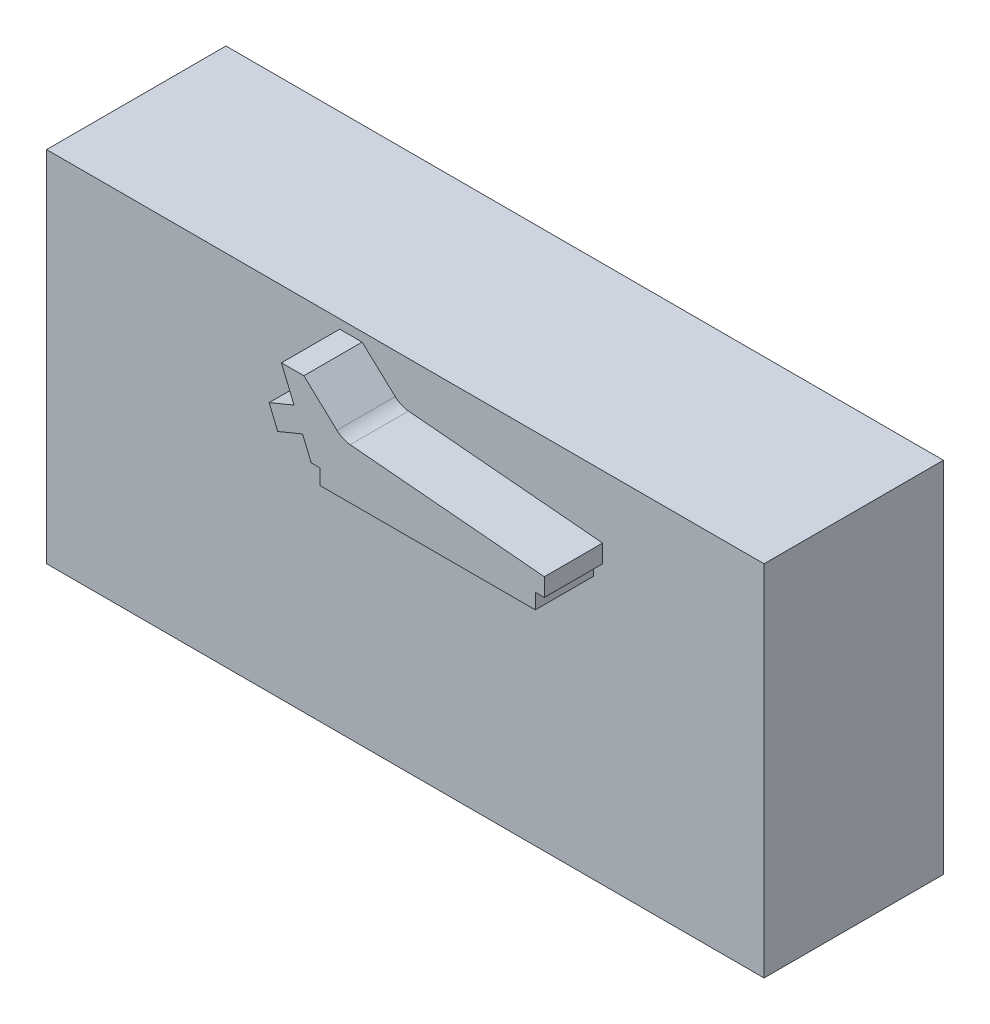
ISO-10303-21;
HEADER;
FILE_DESCRIPTION(('STEP AP214'),'2;1');
FILE_NAME('part.step','',(''),(''),'','','');
FILE_SCHEMA(('AUTOMOTIVE_DESIGN { 1 0 10303 214 1 1 1 1 }'));
ENDSEC;
DATA;
#1=APPLICATION_CONTEXT('core data for automotive mechanical design processes');
#2=APPLICATION_PROTOCOL_DEFINITION('international standard','automotive_design',2000,#1);
#3=PRODUCT_CONTEXT('',#1,'mechanical');
#4=PRODUCT('Part','Part','',(#3));
#5=PRODUCT_RELATED_PRODUCT_CATEGORY('part','',(#4));
#6=PRODUCT_DEFINITION_FORMATION('','',#4);
#7=PRODUCT_DEFINITION_CONTEXT('part definition',#1,'design');
#8=PRODUCT_DEFINITION('design','',#6,#7);
#9=PRODUCT_DEFINITION_SHAPE('','',#8);
#10=(LENGTH_UNIT() NAMED_UNIT(*) SI_UNIT(.MILLI.,.METRE.));
#11=(NAMED_UNIT(*) PLANE_ANGLE_UNIT() SI_UNIT($,.RADIAN.));
#12=(NAMED_UNIT(*) SI_UNIT($,.STERADIAN.) SOLID_ANGLE_UNIT());
#13=UNCERTAINTY_MEASURE_WITH_UNIT(LENGTH_MEASURE(1.E-05),#10,'distance_accuracy_value','');
#14=(GEOMETRIC_REPRESENTATION_CONTEXT(3) GLOBAL_UNCERTAINTY_ASSIGNED_CONTEXT((#13)) GLOBAL_UNIT_ASSIGNED_CONTEXT((#10,
#11,#12)) REPRESENTATION_CONTEXT('',''));
#15=CARTESIAN_POINT('',(0.,0.,0.));
#16=DIRECTION('',(0.,0.,1.));
#17=DIRECTION('',(1.,0.,0.));
#18=AXIS2_PLACEMENT_3D('',#15,#16,#17);
#19=CARTESIAN_POINT('',(0.,0.,50.8));
#20=DIRECTION('',(1.,0.,0.));
#21=DIRECTION('',(0.,0.,-1.));
#22=AXIS2_PLACEMENT_3D('',#19,#20,#21);
#23=PLANE('',#22);
#24=DIRECTION('',(0.,-1.,0.));
#25=VECTOR('',#24,1.);
#26=CARTESIAN_POINT('',(0.,0.,0.));
#27=LINE('',#26,#25);
#28=CARTESIAN_POINT('',(0.,101.6,0.));
#29=VERTEX_POINT('',#28);
#30=CARTESIAN_POINT('',(0.,0.,0.));
#31=VERTEX_POINT('',#30);
#32=EDGE_CURVE('E173',#29,#31,#27,.T.);
#33=ORIENTED_EDGE('',*,*,#32,.T.);
#34=DIRECTION('',(0.,0.,-1.));
#35=VECTOR('',#34,1.);
#36=CARTESIAN_POINT('',(0.,0.,50.8));
#37=LINE('',#36,#35);
#38=CARTESIAN_POINT('',(0.,0.,50.8));
#39=VERTEX_POINT('',#38);
#40=EDGE_CURVE('E11',#39,#31,#37,.T.);
#41=ORIENTED_EDGE('',*,*,#40,.F.);
#42=DIRECTION('',(0.,-1.,0.));
#43=VECTOR('',#42,1.);
#44=CARTESIAN_POINT('',(0.,0.,50.8));
#45=LINE('',#44,#43);
#46=CARTESIAN_POINT('',(0.,101.6,50.8));
#47=VERTEX_POINT('',#46);
#48=EDGE_CURVE('E300',#47,#39,#45,.T.);
#49=ORIENTED_EDGE('',*,*,#48,.F.);
#50=DIRECTION('',(0.,0.,-1.));
#51=VECTOR('',#50,1.);
#52=CARTESIAN_POINT('',(0.,101.6,50.8));
#53=LINE('',#52,#51);
#54=EDGE_CURVE('E309',#47,#29,#53,.T.);
#55=ORIENTED_EDGE('',*,*,#54,.T.);
#56=EDGE_LOOP('',(#33,#41,#49,#55));
#57=FACE_BOUND('',#56,.T.);
#58=ADVANCED_FACE('F37',(#57),#23,.F.);
#59=CARTESIAN_POINT('',(0.,0.,50.8));
#60=DIRECTION('',(0.,1.,0.));
#61=DIRECTION('',(0.,0.,1.));
#62=AXIS2_PLACEMENT_3D('',#59,#60,#61);
#63=PLANE('',#62);
#64=DIRECTION('',(1.,0.,0.));
#65=VECTOR('',#64,1.);
#66=CARTESIAN_POINT('',(0.,0.,0.));
#67=LINE('',#66,#65);
#68=CARTESIAN_POINT('',(203.2,0.,0.));
#69=VERTEX_POINT('',#68);
#70=EDGE_CURVE('E294',#31,#69,#67,.T.);
#71=ORIENTED_EDGE('',*,*,#70,.T.);
#72=DIRECTION('',(0.,0.,-1.));
#73=VECTOR('',#72,1.);
#74=CARTESIAN_POINT('',(203.2,0.,50.8));
#75=LINE('',#74,#73);
#76=CARTESIAN_POINT('',(203.2,0.,50.8));
#77=VERTEX_POINT('',#76);
#78=EDGE_CURVE('E44',#77,#69,#75,.T.);
#79=ORIENTED_EDGE('',*,*,#78,.F.);
#80=DIRECTION('',(1.,0.,0.));
#81=VECTOR('',#80,1.);
#82=CARTESIAN_POINT('',(0.,0.,50.8));
#83=LINE('',#82,#81);
#84=EDGE_CURVE('E303',#39,#77,#83,.T.);
#85=ORIENTED_EDGE('',*,*,#84,.F.);
#86=ORIENTED_EDGE('',*,*,#40,.T.);
#87=EDGE_LOOP('',(#71,#79,#85,#86));
#88=FACE_BOUND('',#87,.T.);
#89=ADVANCED_FACE('F335',(#88),#63,.F.);
#90=CARTESIAN_POINT('',(203.2,0.,50.8));
#91=DIRECTION('',(-1.,0.,0.));
#92=DIRECTION('',(0.,0.,1.));
#93=AXIS2_PLACEMENT_3D('',#90,#91,#92);
#94=PLANE('',#93);
#95=DIRECTION('',(0.,1.,0.));
#96=VECTOR('',#95,1.);
#97=CARTESIAN_POINT('',(203.2,0.,0.));
#98=LINE('',#97,#96);
#99=CARTESIAN_POINT('',(203.2,101.6,0.));
#100=VERTEX_POINT('',#99);
#101=EDGE_CURVE('E296',#69,#100,#98,.T.);
#102=ORIENTED_EDGE('',*,*,#101,.T.);
#103=DIRECTION('',(0.,0.,-1.));
#104=VECTOR('',#103,1.);
#105=CARTESIAN_POINT('',(203.2,101.6,50.8));
#106=LINE('',#105,#104);
#107=CARTESIAN_POINT('',(203.2,101.6,50.8));
#108=VERTEX_POINT('',#107);
#109=EDGE_CURVE('E312',#108,#100,#106,.T.);
#110=ORIENTED_EDGE('',*,*,#109,.F.);
#111=DIRECTION('',(0.,1.,0.));
#112=VECTOR('',#111,1.);
#113=CARTESIAN_POINT('',(203.2,0.,50.8));
#114=LINE('',#113,#112);
#115=EDGE_CURVE('E305',#77,#108,#114,.T.);
#116=ORIENTED_EDGE('',*,*,#115,.F.);
#117=ORIENTED_EDGE('',*,*,#78,.T.);
#118=EDGE_LOOP('',(#102,#110,#116,#117));
#119=FACE_BOUND('',#118,.T.);
#120=ADVANCED_FACE('F319',(#119),#94,.F.);
#121=CARTESIAN_POINT('',(0.,101.6,50.8));
#122=DIRECTION('',(0.,-1.,0.));
#123=DIRECTION('',(0.,0.,-1.));
#124=AXIS2_PLACEMENT_3D('',#121,#122,#123);
#125=PLANE('',#124);
#126=DIRECTION('',(-1.,0.,0.));
#127=VECTOR('',#126,1.);
#128=CARTESIAN_POINT('',(0.,101.6,0.));
#129=LINE('',#128,#127);
#130=EDGE_CURVE('E298',#100,#29,#129,.T.);
#131=ORIENTED_EDGE('',*,*,#130,.T.);
#132=ORIENTED_EDGE('',*,*,#54,.F.);
#133=DIRECTION('',(-1.,0.,0.));
#134=VECTOR('',#133,1.);
#135=CARTESIAN_POINT('',(0.,101.6,50.8));
#136=LINE('',#135,#134);
#137=EDGE_CURVE('E307',#108,#47,#136,.T.);
#138=ORIENTED_EDGE('',*,*,#137,.F.);
#139=ORIENTED_EDGE('',*,*,#109,.T.);
#140=EDGE_LOOP('',(#131,#132,#138,#139));
#141=FACE_BOUND('',#140,.T.);
#142=ADVANCED_FACE('F328',(#141),#125,.F.);
#143=CARTESIAN_POINT('',(0.,101.6,50.8));
#144=DIRECTION('',(0.,0.,-1.));
#145=DIRECTION('',(-1.,0.,0.));
#146=AXIS2_PLACEMENT_3D('',#143,#144,#145);
#147=PLANE('',#146);
#148=DIRECTION('',(-0.733266821544927,0.679941003632962,0.));
#149=VECTOR('',#148,1.);
#150=CARTESIAN_POINT('',(208.181982596549,-11.1085959651032,50.8));
#151=LINE('',#150,#149);
#152=CARTESIAN_POINT('',(98.7376529803762,90.3765457795755,50.8));
#153=VERTEX_POINT('',#152);
#154=CARTESIAN_POINT('',(89.3731804125787,99.06,50.8));
#155=VERTEX_POINT('',#154);
#156=EDGE_CURVE('E51',#153,#155,#151,.T.);
#157=ORIENTED_EDGE('',*,*,#156,.F.);
#158=CARTESIAN_POINT('',(103.055278353446,95.0327900963858,50.8));
#159=DIRECTION('',(0.,0.,1.));
#160=DIRECTION('',(1.,0.,0.));
#161=AXIS2_PLACEMENT_3D('',#158,#159,#160);
#162=CIRCLE('',#161,6.35);
#163=CARTESIAN_POINT('',(102.493050685143,88.7077288279872,50.8));
#164=VERTEX_POINT('',#163);
#165=EDGE_CURVE('E171',#153,#164,#162,.T.);
#166=ORIENTED_EDGE('',*,*,#165,.T.);
#167=DIRECTION('',(-0.996072640692687,0.0885397902837935,0.));
#168=VECTOR('',#167,1.);
#169=CARTESIAN_POINT('',(120.546883616443,87.1029436785384,50.8));
#170=LINE('',#169,#168);
#171=CARTESIAN_POINT('',(157.48,83.82,50.8));
#172=VERTEX_POINT('',#171);
#173=EDGE_CURVE('E188',#172,#164,#170,.T.);
#174=ORIENTED_EDGE('',*,*,#173,.F.);
#175=DIRECTION('',(0.,1.,0.));
#176=VECTOR('',#175,1.);
#177=CARTESIAN_POINT('',(157.48,-126.049497006446,50.8));
#178=LINE('',#177,#176);
#179=CARTESIAN_POINT('',(157.48,78.74,50.8));
#180=VERTEX_POINT('',#179);
#181=EDGE_CURVE('E191',#180,#172,#178,.T.);
#182=ORIENTED_EDGE('',*,*,#181,.F.);
#183=DIRECTION('',(1.,0.,0.));
#184=VECTOR('',#183,1.);
#185=CARTESIAN_POINT('',(101.6,78.74,50.8));
#186=LINE('',#185,#184);
#187=CARTESIAN_POINT('',(154.94,78.74,50.8));
#188=VERTEX_POINT('',#187);
#189=EDGE_CURVE('E249',#188,#180,#186,.T.);
#190=ORIENTED_EDGE('',*,*,#189,.F.);
#191=DIRECTION('',(0.,1.,0.));
#192=VECTOR('',#191,1.);
#193=CARTESIAN_POINT('',(154.94,-126.049497006446,50.8));
#194=LINE('',#193,#192);
#195=CARTESIAN_POINT('',(154.94,74.422,50.8));
#196=VERTEX_POINT('',#195);
#197=EDGE_CURVE('E246',#196,#188,#194,.T.);
#198=ORIENTED_EDGE('',*,*,#197,.F.);
#199=DIRECTION('',(1.,0.,0.));
#200=VECTOR('',#199,1.);
#201=CARTESIAN_POINT('',(101.6,74.422,50.8));
#202=LINE('',#201,#200);
#203=CARTESIAN_POINT('',(93.98,74.422,50.8));
#204=VERTEX_POINT('',#203);
#205=EDGE_CURVE('E243',#204,#196,#202,.T.);
#206=ORIENTED_EDGE('',*,*,#205,.F.);
#207=DIRECTION('',(0.,-1.,0.));
#208=VECTOR('',#207,1.);
#209=CARTESIAN_POINT('',(93.98,-126.049497006446,50.8));
#210=LINE('',#209,#208);
#211=CARTESIAN_POINT('',(93.98,78.74,50.8));
#212=VERTEX_POINT('',#211);
#213=EDGE_CURVE('E240',#212,#204,#210,.T.);
#214=ORIENTED_EDGE('',*,*,#213,.F.);
#215=DIRECTION('',(1.,0.,0.));
#216=VECTOR('',#215,1.);
#217=CARTESIAN_POINT('',(101.6,78.74,50.8));
#218=LINE('',#217,#216);
#219=CARTESIAN_POINT('',(91.44,78.74,50.8));
#220=VERTEX_POINT('',#219);
#221=EDGE_CURVE('E237',#220,#212,#218,.T.);
#222=ORIENTED_EDGE('',*,*,#221,.F.);
#223=DIRECTION('',(0.382683432365087,-0.923879532511288,0.));
#224=VECTOR('',#223,1.);
#225=CARTESIAN_POINT('',(165.331918576092,-99.6508719761715,50.8));
#226=LINE('',#225,#224);
#227=CARTESIAN_POINT('',(89.0099602044817,84.6066350314467,50.8));
#228=VERTEX_POINT('',#227);
#229=EDGE_CURVE('E234',#228,#220,#226,.T.);
#230=ORIENTED_EDGE('',*,*,#229,.F.);
#231=DIRECTION('',(0.923879532511288,0.382683432365087,0.));
#232=VECTOR('',#231,1.);
#233=CARTESIAN_POINT('',(25.2780416283897,58.2080100011718,50.8));
#234=LINE('',#233,#232);
#235=CARTESIAN_POINT('',(81.9699981667457,81.6905872768247,50.8));
#236=VERTEX_POINT('',#235);
#237=EDGE_CURVE('E231',#236,#228,#234,.T.);
#238=ORIENTED_EDGE('',*,*,#237,.F.);
#239=DIRECTION('',(0.382683432365087,-0.923879532511288,0.));
#240=VECTOR('',#239,1.);
#241=CARTESIAN_POINT('',(158.291956538356,-102.566919730793,50.8));
#242=LINE('',#241,#240);
#243=CARTESIAN_POINT('',(79.5399583712273,87.5572223082714,50.8));
#244=VERTEX_POINT('',#243);
#245=EDGE_CURVE('E228',#244,#236,#242,.T.);
#246=ORIENTED_EDGE('',*,*,#245,.F.);
#247=DIRECTION('',(0.923879532511287,0.382683432365089,0.));
#248=VECTOR('',#247,1.);
#249=CARTESIAN_POINT('',(22.848001832871,64.0746450326182,50.8));
#250=LINE('',#249,#248);
#251=CARTESIAN_POINT('',(86.5799204089634,90.4732700628933,50.8));
#252=VERTEX_POINT('',#251);
#253=EDGE_CURVE('E226',#244,#252,#250,.T.);
#254=ORIENTED_EDGE('',*,*,#253,.T.);
#255=DIRECTION('',(-0.382683432365091,0.923879532511286,0.));
#256=VECTOR('',#255,1.);
#257=CARTESIAN_POINT('',(165.331918576093,-99.6508719761708,50.8));
#258=LINE('',#257,#256);
#259=CARTESIAN_POINT('',(83.0231804125788,99.06,50.8));
#260=VERTEX_POINT('',#259);
#261=EDGE_CURVE('E224',#252,#260,#258,.T.);
#262=ORIENTED_EDGE('',*,*,#261,.T.);
#263=DIRECTION('',(-1.,0.,0.));
#264=VECTOR('',#263,1.);
#265=CARTESIAN_POINT('',(101.6,99.06,50.8));
#266=LINE('',#265,#264);
#267=EDGE_CURVE('E56',#155,#260,#266,.T.);
#268=ORIENTED_EDGE('',*,*,#267,.F.);
#269=EDGE_LOOP('',(#157,#166,#174,#182,#190,#198,#206,#214,#222,#230,#238,#246,#254,#262,#268));
#270=FACE_BOUND('',#269,.T.);
#271=ORIENTED_EDGE('',*,*,#48,.T.);
#272=ORIENTED_EDGE('',*,*,#84,.T.);
#273=ORIENTED_EDGE('',*,*,#115,.T.);
#274=ORIENTED_EDGE('',*,*,#137,.T.);
#275=EDGE_LOOP('',(#271,#272,#273,#274));
#276=FACE_BOUND('',#275,.T.);
#277=ADVANCED_FACE('F334',(#270,#276),#147,.F.);
#278=CARTESIAN_POINT('',(0.,101.6,0.));
#279=DIRECTION('',(0.,0.,-1.));
#280=DIRECTION('',(-1.,0.,0.));
#281=AXIS2_PLACEMENT_3D('',#278,#279,#280);
#282=PLANE('',#281);
#283=ORIENTED_EDGE('',*,*,#32,.F.);
#284=ORIENTED_EDGE('',*,*,#130,.F.);
#285=ORIENTED_EDGE('',*,*,#101,.F.);
#286=ORIENTED_EDGE('',*,*,#70,.F.);
#287=EDGE_LOOP('',(#283,#284,#285,#286));
#288=FACE_BOUND('',#287,.T.);
#289=ADVANCED_FACE('F325',(#288),#282,.T.);
#290=CARTESIAN_POINT('',(103.055278353446,95.0327900963858,67.31));
#291=DIRECTION('',(0.,0.,-1.));
#292=DIRECTION('',(-1.,0.,0.));
#293=AXIS2_PLACEMENT_3D('',#290,#291,#292);
#294=CYLINDRICAL_SURFACE('',#293,6.35);
#295=ORIENTED_EDGE('',*,*,#165,.F.);
#296=DIRECTION('',(0.,0.,-1.));
#297=VECTOR('',#296,1.);
#298=CARTESIAN_POINT('',(98.7376529803762,90.3765457795755,67.31));
#299=LINE('',#298,#297);
#300=CARTESIAN_POINT('',(98.7376529803762,90.3765457795755,67.31));
#301=VERTEX_POINT('',#300);
#302=EDGE_CURVE('E165',#301,#153,#299,.T.);
#303=ORIENTED_EDGE('',*,*,#302,.F.);
#304=CARTESIAN_POINT('',(103.055278353446,95.0327900963858,67.31));
#305=DIRECTION('',(0.,0.,1.));
#306=DIRECTION('',(1.,0.,0.));
#307=AXIS2_PLACEMENT_3D('',#304,#305,#306);
#308=CIRCLE('',#307,6.35);
#309=CARTESIAN_POINT('',(102.493050685143,88.7077288279872,67.31));
#310=VERTEX_POINT('',#309);
#311=EDGE_CURVE('E170',#301,#310,#308,.T.);
#312=ORIENTED_EDGE('',*,*,#311,.T.);
#313=DIRECTION('',(0.,0.,-1.));
#314=VECTOR('',#313,1.);
#315=CARTESIAN_POINT('',(102.493050685143,88.7077288279872,67.31));
#316=LINE('',#315,#314);
#317=EDGE_CURVE('E220',#310,#164,#316,.T.);
#318=ORIENTED_EDGE('',*,*,#317,.T.);
#319=EDGE_LOOP('',(#295,#303,#312,#318));
#320=FACE_BOUND('',#319,.T.);
#321=ADVANCED_FACE('F167',(#320),#294,.F.);
#322=CARTESIAN_POINT('',(208.181982596549,-11.1085959651032,67.31));
#323=DIRECTION('',(-0.679941003632963,-0.733266821544927,0.));
#324=DIRECTION('',(0.733266821544927,-0.679941003632963,0.));
#325=AXIS2_PLACEMENT_3D('',#322,#323,#324);
#326=PLANE('',#325);
#327=ORIENTED_EDGE('',*,*,#156,.T.);
#328=DIRECTION('',(0.,0.,-1.));
#329=VECTOR('',#328,1.);
#330=CARTESIAN_POINT('',(89.3731804125787,99.06,67.31));
#331=LINE('',#330,#329);
#332=CARTESIAN_POINT('',(89.3731804125787,99.06,67.31));
#333=VERTEX_POINT('',#332);
#334=EDGE_CURVE('E174',#333,#155,#331,.T.);
#335=ORIENTED_EDGE('',*,*,#334,.F.);
#336=DIRECTION('',(-0.733266821544927,0.679941003632962,0.));
#337=VECTOR('',#336,1.);
#338=CARTESIAN_POINT('',(208.181982596549,-11.1085959651032,67.31));
#339=LINE('',#338,#337);
#340=EDGE_CURVE('E177',#301,#333,#339,.T.);
#341=ORIENTED_EDGE('',*,*,#340,.F.);
#342=ORIENTED_EDGE('',*,*,#302,.T.);
#343=EDGE_LOOP('',(#327,#335,#341,#342));
#344=FACE_BOUND('',#343,.T.);
#345=ADVANCED_FACE('F178',(#344),#326,.F.);
#346=CARTESIAN_POINT('',(101.6,99.06,67.31));
#347=DIRECTION('',(0.,-1.,0.));
#348=DIRECTION('',(0.,0.,-1.));
#349=AXIS2_PLACEMENT_3D('',#346,#347,#348);
#350=PLANE('',#349);
#351=ORIENTED_EDGE('',*,*,#267,.T.);
#352=DIRECTION('',(0.,0.,-1.));
#353=VECTOR('',#352,1.);
#354=CARTESIAN_POINT('',(83.0231804125788,99.06,67.31));
#355=LINE('',#354,#353);
#356=CARTESIAN_POINT('',(83.0231804125788,99.06,67.31));
#357=VERTEX_POINT('',#356);
#358=EDGE_CURVE('E288',#357,#260,#355,.T.);
#359=ORIENTED_EDGE('',*,*,#358,.F.);
#360=DIRECTION('',(-1.,0.,0.));
#361=VECTOR('',#360,1.);
#362=CARTESIAN_POINT('',(101.6,99.06,67.31));
#363=LINE('',#362,#361);
#364=EDGE_CURVE('E182',#333,#357,#363,.T.);
#365=ORIENTED_EDGE('',*,*,#364,.F.);
#366=ORIENTED_EDGE('',*,*,#334,.T.);
#367=EDGE_LOOP('',(#351,#359,#365,#366));
#368=FACE_BOUND('',#367,.T.);
#369=ADVANCED_FACE('F353',(#368),#350,.F.);
#370=CARTESIAN_POINT('',(165.331918576093,-99.6508719761708,67.31));
#371=DIRECTION('',(-0.923879532511286,-0.382683432365091,0.));
#372=DIRECTION('',(0.382683432365091,-0.923879532511286,0.));
#373=AXIS2_PLACEMENT_3D('',#370,#371,#372);
#374=PLANE('',#373);
#375=ORIENTED_EDGE('',*,*,#261,.F.);
#376=DIRECTION('',(0.,0.,-1.));
#377=VECTOR('',#376,1.);
#378=CARTESIAN_POINT('',(86.5799204089634,90.4732700628933,67.31));
#379=LINE('',#378,#377);
#380=CARTESIAN_POINT('',(86.5799204089634,90.4732700628933,67.31));
#381=VERTEX_POINT('',#380);
#382=EDGE_CURVE('E285',#381,#252,#379,.T.);
#383=ORIENTED_EDGE('',*,*,#382,.F.);
#384=DIRECTION('',(-0.382683432365091,0.923879532511286,0.));
#385=VECTOR('',#384,1.);
#386=CARTESIAN_POINT('',(165.331918576093,-99.6508719761708,67.31));
#387=LINE('',#386,#385);
#388=EDGE_CURVE('E195',#381,#357,#387,.T.);
#389=ORIENTED_EDGE('',*,*,#388,.T.);
#390=ORIENTED_EDGE('',*,*,#358,.T.);
#391=EDGE_LOOP('',(#375,#383,#389,#390));
#392=FACE_BOUND('',#391,.T.);
#393=ADVANCED_FACE('F356',(#392),#374,.T.);
#394=CARTESIAN_POINT('',(22.848001832871,64.0746450326182,67.31));
#395=DIRECTION('',(-0.382683432365089,0.923879532511287,0.));
#396=DIRECTION('',(-0.923879532511287,-0.382683432365089,0.));
#397=AXIS2_PLACEMENT_3D('',#394,#395,#396);
#398=PLANE('',#397);
#399=ORIENTED_EDGE('',*,*,#253,.F.);
#400=DIRECTION('',(0.,0.,-1.));
#401=VECTOR('',#400,1.);
#402=CARTESIAN_POINT('',(79.5399583712274,87.5572223082714,67.31));
#403=LINE('',#402,#401);
#404=CARTESIAN_POINT('',(79.5399583712274,87.5572223082714,67.31));
#405=VERTEX_POINT('',#404);
#406=EDGE_CURVE('E282',#405,#244,#403,.T.);
#407=ORIENTED_EDGE('',*,*,#406,.F.);
#408=DIRECTION('',(0.923879532511287,0.382683432365089,0.));
#409=VECTOR('',#408,1.);
#410=CARTESIAN_POINT('',(22.848001832871,64.0746450326182,67.31));
#411=LINE('',#410,#409);
#412=EDGE_CURVE('E198',#405,#381,#411,.T.);
#413=ORIENTED_EDGE('',*,*,#412,.T.);
#414=ORIENTED_EDGE('',*,*,#382,.T.);
#415=EDGE_LOOP('',(#399,#407,#413,#414));
#416=FACE_BOUND('',#415,.T.);
#417=ADVANCED_FACE('F360',(#416),#398,.T.);
#418=CARTESIAN_POINT('',(158.291956538356,-102.566919730793,67.31));
#419=DIRECTION('',(0.923879532511288,0.382683432365087,0.));
#420=DIRECTION('',(-0.382683432365087,0.923879532511288,0.));
#421=AXIS2_PLACEMENT_3D('',#418,#419,#420);
#422=PLANE('',#421);
#423=ORIENTED_EDGE('',*,*,#245,.T.);
#424=DIRECTION('',(0.,0.,-1.));
#425=VECTOR('',#424,1.);
#426=CARTESIAN_POINT('',(81.9699981667457,81.6905872768247,67.31));
#427=LINE('',#426,#425);
#428=CARTESIAN_POINT('',(81.9699981667457,81.6905872768247,67.31));
#429=VERTEX_POINT('',#428);
#430=EDGE_CURVE('E279',#429,#236,#427,.T.);
#431=ORIENTED_EDGE('',*,*,#430,.F.);
#432=DIRECTION('',(0.382683432365087,-0.923879532511288,0.));
#433=VECTOR('',#432,1.);
#434=CARTESIAN_POINT('',(158.291956538356,-102.566919730793,67.31));
#435=LINE('',#434,#433);
#436=EDGE_CURVE('E201',#405,#429,#435,.T.);
#437=ORIENTED_EDGE('',*,*,#436,.F.);
#438=ORIENTED_EDGE('',*,*,#406,.T.);
#439=EDGE_LOOP('',(#423,#431,#437,#438));
#440=FACE_BOUND('',#439,.T.);
#441=ADVANCED_FACE('F364',(#440),#422,.F.);
#442=CARTESIAN_POINT('',(25.2780416283897,58.2080100011718,67.31));
#443=DIRECTION('',(-0.382683432365087,0.923879532511288,0.));
#444=DIRECTION('',(-0.923879532511288,-0.382683432365087,0.));
#445=AXIS2_PLACEMENT_3D('',#442,#443,#444);
#446=PLANE('',#445);
#447=ORIENTED_EDGE('',*,*,#237,.T.);
#448=DIRECTION('',(0.,0.,-1.));
#449=VECTOR('',#448,1.);
#450=CARTESIAN_POINT('',(89.0099602044817,84.6066350314467,67.31));
#451=LINE('',#450,#449);
#452=CARTESIAN_POINT('',(89.0099602044817,84.6066350314467,67.31));
#453=VERTEX_POINT('',#452);
#454=EDGE_CURVE('E276',#453,#228,#451,.T.);
#455=ORIENTED_EDGE('',*,*,#454,.F.);
#456=DIRECTION('',(0.923879532511288,0.382683432365087,0.));
#457=VECTOR('',#456,1.);
#458=CARTESIAN_POINT('',(25.2780416283897,58.2080100011718,67.31));
#459=LINE('',#458,#457);
#460=EDGE_CURVE('E203',#429,#453,#459,.T.);
#461=ORIENTED_EDGE('',*,*,#460,.F.);
#462=ORIENTED_EDGE('',*,*,#430,.T.);
#463=EDGE_LOOP('',(#447,#455,#461,#462));
#464=FACE_BOUND('',#463,.T.);
#465=ADVANCED_FACE('F368',(#464),#446,.F.);
#466=CARTESIAN_POINT('',(165.331918576092,-99.6508719761715,67.31));
#467=DIRECTION('',(0.923879532511288,0.382683432365087,0.));
#468=DIRECTION('',(-0.382683432365087,0.923879532511288,0.));
#469=AXIS2_PLACEMENT_3D('',#466,#467,#468);
#470=PLANE('',#469);
#471=ORIENTED_EDGE('',*,*,#229,.T.);
#472=DIRECTION('',(0.,0.,-1.));
#473=VECTOR('',#472,1.);
#474=CARTESIAN_POINT('',(91.44,78.74,67.31));
#475=LINE('',#474,#473);
#476=CARTESIAN_POINT('',(91.44,78.74,67.31));
#477=VERTEX_POINT('',#476);
#478=EDGE_CURVE('E273',#477,#220,#475,.T.);
#479=ORIENTED_EDGE('',*,*,#478,.F.);
#480=DIRECTION('',(0.382683432365087,-0.923879532511288,0.));
#481=VECTOR('',#480,1.);
#482=CARTESIAN_POINT('',(165.331918576092,-99.6508719761715,67.31));
#483=LINE('',#482,#481);
#484=EDGE_CURVE('E205',#453,#477,#483,.T.);
#485=ORIENTED_EDGE('',*,*,#484,.F.);
#486=ORIENTED_EDGE('',*,*,#454,.T.);
#487=EDGE_LOOP('',(#471,#479,#485,#486));
#488=FACE_BOUND('',#487,.T.);
#489=ADVANCED_FACE('F372',(#488),#470,.F.);
#490=CARTESIAN_POINT('',(101.6,78.74,67.31));
#491=DIRECTION('',(0.,1.,0.));
#492=DIRECTION('',(0.,0.,1.));
#493=AXIS2_PLACEMENT_3D('',#490,#491,#492);
#494=PLANE('',#493);
#495=ORIENTED_EDGE('',*,*,#221,.T.);
#496=DIRECTION('',(0.,0.,-1.));
#497=VECTOR('',#496,1.);
#498=CARTESIAN_POINT('',(93.98,78.74,67.31));
#499=LINE('',#498,#497);
#500=CARTESIAN_POINT('',(93.98,78.74,67.31));
#501=VERTEX_POINT('',#500);
#502=EDGE_CURVE('E270',#501,#212,#499,.T.);
#503=ORIENTED_EDGE('',*,*,#502,.F.);
#504=DIRECTION('',(1.,0.,0.));
#505=VECTOR('',#504,1.);
#506=CARTESIAN_POINT('',(101.6,78.74,67.31));
#507=LINE('',#506,#505);
#508=EDGE_CURVE('E207',#477,#501,#507,.T.);
#509=ORIENTED_EDGE('',*,*,#508,.F.);
#510=ORIENTED_EDGE('',*,*,#478,.T.);
#511=EDGE_LOOP('',(#495,#503,#509,#510));
#512=FACE_BOUND('',#511,.T.);
#513=ADVANCED_FACE('F376',(#512),#494,.F.);
#514=CARTESIAN_POINT('',(93.98,-126.049497006446,67.31));
#515=DIRECTION('',(1.,0.,0.));
#516=DIRECTION('',(0.,0.,-1.));
#517=AXIS2_PLACEMENT_3D('',#514,#515,#516);
#518=PLANE('',#517);
#519=ORIENTED_EDGE('',*,*,#213,.T.);
#520=DIRECTION('',(0.,0.,-1.));
#521=VECTOR('',#520,1.);
#522=CARTESIAN_POINT('',(93.98,74.422,67.31));
#523=LINE('',#522,#521);
#524=CARTESIAN_POINT('',(93.98,74.422,67.31));
#525=VERTEX_POINT('',#524);
#526=EDGE_CURVE('E267',#525,#204,#523,.T.);
#527=ORIENTED_EDGE('',*,*,#526,.F.);
#528=DIRECTION('',(0.,-1.,0.));
#529=VECTOR('',#528,1.);
#530=CARTESIAN_POINT('',(93.98,-126.049497006446,67.31));
#531=LINE('',#530,#529);
#532=EDGE_CURVE('E209',#501,#525,#531,.T.);
#533=ORIENTED_EDGE('',*,*,#532,.F.);
#534=ORIENTED_EDGE('',*,*,#502,.T.);
#535=EDGE_LOOP('',(#519,#527,#533,#534));
#536=FACE_BOUND('',#535,.T.);
#537=ADVANCED_FACE('F380',(#536),#518,.F.);
#538=CARTESIAN_POINT('',(101.6,74.422,67.31));
#539=DIRECTION('',(0.,1.,0.));
#540=DIRECTION('',(0.,0.,1.));
#541=AXIS2_PLACEMENT_3D('',#538,#539,#540);
#542=PLANE('',#541);
#543=ORIENTED_EDGE('',*,*,#205,.T.);
#544=DIRECTION('',(0.,0.,-1.));
#545=VECTOR('',#544,1.);
#546=CARTESIAN_POINT('',(154.94,74.422,67.31));
#547=LINE('',#546,#545);
#548=CARTESIAN_POINT('',(154.94,74.422,67.31));
#549=VERTEX_POINT('',#548);
#550=EDGE_CURVE('E264',#549,#196,#547,.T.);
#551=ORIENTED_EDGE('',*,*,#550,.F.);
#552=DIRECTION('',(1.,0.,0.));
#553=VECTOR('',#552,1.);
#554=CARTESIAN_POINT('',(101.6,74.422,67.31));
#555=LINE('',#554,#553);
#556=EDGE_CURVE('E211',#525,#549,#555,.T.);
#557=ORIENTED_EDGE('',*,*,#556,.F.);
#558=ORIENTED_EDGE('',*,*,#526,.T.);
#559=EDGE_LOOP('',(#543,#551,#557,#558));
#560=FACE_BOUND('',#559,.T.);
#561=ADVANCED_FACE('F384',(#560),#542,.F.);
#562=CARTESIAN_POINT('',(154.94,-126.049497006446,67.31));
#563=DIRECTION('',(-1.,0.,0.));
#564=DIRECTION('',(0.,0.,1.));
#565=AXIS2_PLACEMENT_3D('',#562,#563,#564);
#566=PLANE('',#565);
#567=ORIENTED_EDGE('',*,*,#197,.T.);
#568=DIRECTION('',(0.,0.,-1.));
#569=VECTOR('',#568,1.);
#570=CARTESIAN_POINT('',(154.94,78.74,67.31));
#571=LINE('',#570,#569);
#572=CARTESIAN_POINT('',(154.94,78.74,67.31));
#573=VERTEX_POINT('',#572);
#574=EDGE_CURVE('E261',#573,#188,#571,.T.);
#575=ORIENTED_EDGE('',*,*,#574,.F.);
#576=DIRECTION('',(0.,1.,0.));
#577=VECTOR('',#576,1.);
#578=CARTESIAN_POINT('',(154.94,-126.049497006446,67.31));
#579=LINE('',#578,#577);
#580=EDGE_CURVE('E213',#549,#573,#579,.T.);
#581=ORIENTED_EDGE('',*,*,#580,.F.);
#582=ORIENTED_EDGE('',*,*,#550,.T.);
#583=EDGE_LOOP('',(#567,#575,#581,#582));
#584=FACE_BOUND('',#583,.T.);
#585=ADVANCED_FACE('F388',(#584),#566,.F.);
#586=CARTESIAN_POINT('',(101.6,78.74,67.31));
#587=DIRECTION('',(0.,1.,0.));
#588=DIRECTION('',(0.,0.,1.));
#589=AXIS2_PLACEMENT_3D('',#586,#587,#588);
#590=PLANE('',#589);
#591=ORIENTED_EDGE('',*,*,#189,.T.);
#592=DIRECTION('',(0.,0.,-1.));
#593=VECTOR('',#592,1.);
#594=CARTESIAN_POINT('',(157.48,78.74,67.31));
#595=LINE('',#594,#593);
#596=CARTESIAN_POINT('',(157.48,78.74,67.31));
#597=VERTEX_POINT('',#596);
#598=EDGE_CURVE('E258',#597,#180,#595,.T.);
#599=ORIENTED_EDGE('',*,*,#598,.F.);
#600=DIRECTION('',(1.,0.,0.));
#601=VECTOR('',#600,1.);
#602=CARTESIAN_POINT('',(101.6,78.74,67.31));
#603=LINE('',#602,#601);
#604=EDGE_CURVE('E215',#573,#597,#603,.T.);
#605=ORIENTED_EDGE('',*,*,#604,.F.);
#606=ORIENTED_EDGE('',*,*,#574,.T.);
#607=EDGE_LOOP('',(#591,#599,#605,#606));
#608=FACE_BOUND('',#607,.T.);
#609=ADVANCED_FACE('F392',(#608),#590,.F.);
#610=CARTESIAN_POINT('',(157.48,-126.049497006446,67.31));
#611=DIRECTION('',(-1.,0.,0.));
#612=DIRECTION('',(0.,0.,1.));
#613=AXIS2_PLACEMENT_3D('',#610,#611,#612);
#614=PLANE('',#613);
#615=ORIENTED_EDGE('',*,*,#181,.T.);
#616=DIRECTION('',(0.,0.,-1.));
#617=VECTOR('',#616,1.);
#618=CARTESIAN_POINT('',(157.48,83.82,67.31));
#619=LINE('',#618,#617);
#620=CARTESIAN_POINT('',(157.48,83.82,67.31));
#621=VERTEX_POINT('',#620);
#622=EDGE_CURVE('E255',#621,#172,#619,.T.);
#623=ORIENTED_EDGE('',*,*,#622,.F.);
#624=DIRECTION('',(0.,1.,0.));
#625=VECTOR('',#624,1.);
#626=CARTESIAN_POINT('',(157.48,-126.049497006446,67.31));
#627=LINE('',#626,#625);
#628=EDGE_CURVE('E217',#597,#621,#627,.T.);
#629=ORIENTED_EDGE('',*,*,#628,.F.);
#630=ORIENTED_EDGE('',*,*,#598,.T.);
#631=EDGE_LOOP('',(#615,#623,#629,#630));
#632=FACE_BOUND('',#631,.T.);
#633=ADVANCED_FACE('F396',(#632),#614,.F.);
#634=CARTESIAN_POINT('',(120.546883616443,87.1029436785384,67.31));
#635=DIRECTION('',(-0.0885397902837935,-0.996072640692687,0.));
#636=DIRECTION('',(0.996072640692687,-0.0885397902837935,0.));
#637=AXIS2_PLACEMENT_3D('',#634,#635,#636);
#638=PLANE('',#637);
#639=ORIENTED_EDGE('',*,*,#173,.T.);
#640=ORIENTED_EDGE('',*,*,#317,.F.);
#641=DIRECTION('',(-0.996072640692687,0.0885397902837935,0.));
#642=VECTOR('',#641,1.);
#643=CARTESIAN_POINT('',(120.546883616443,87.1029436785384,67.31));
#644=LINE('',#643,#642);
#645=EDGE_CURVE('E186',#621,#310,#644,.T.);
#646=ORIENTED_EDGE('',*,*,#645,.F.);
#647=ORIENTED_EDGE('',*,*,#622,.T.);
#648=EDGE_LOOP('',(#639,#640,#646,#647));
#649=FACE_BOUND('',#648,.T.);
#650=ADVANCED_FACE('F400',(#649),#638,.F.);
#651=CARTESIAN_POINT('',(101.6,-126.049497006446,67.31));
#652=DIRECTION('',(0.,0.,1.));
#653=DIRECTION('',(1.,0.,0.));
#654=AXIS2_PLACEMENT_3D('',#651,#652,#653);
#655=PLANE('',#654);
#656=ORIENTED_EDGE('',*,*,#311,.F.);
#657=ORIENTED_EDGE('',*,*,#340,.T.);
#658=ORIENTED_EDGE('',*,*,#364,.T.);
#659=ORIENTED_EDGE('',*,*,#388,.F.);
#660=ORIENTED_EDGE('',*,*,#412,.F.);
#661=ORIENTED_EDGE('',*,*,#436,.T.);
#662=ORIENTED_EDGE('',*,*,#460,.T.);
#663=ORIENTED_EDGE('',*,*,#484,.T.);
#664=ORIENTED_EDGE('',*,*,#508,.T.);
#665=ORIENTED_EDGE('',*,*,#532,.T.);
#666=ORIENTED_EDGE('',*,*,#556,.T.);
#667=ORIENTED_EDGE('',*,*,#580,.T.);
#668=ORIENTED_EDGE('',*,*,#604,.T.);
#669=ORIENTED_EDGE('',*,*,#628,.T.);
#670=ORIENTED_EDGE('',*,*,#645,.T.);
#671=EDGE_LOOP('',(#656,#657,#658,#659,#660,#661,#662,#663,#664,#665,#666,#667,#668,#669,#670));
#672=FACE_BOUND('',#671,.T.);
#673=ADVANCED_FACE('F184',(#672),#655,.T.);
#674=CLOSED_SHELL('',(#58,#89,#120,#142,#277,#289,#321,#345,#369,#393,#417,#441,#465,#489,#513,
#537,#561,#585,#609,#633,#650,#673));
#675=MANIFOLD_SOLID_BREP('B2',#674);
#676=ADVANCED_BREP_SHAPE_REPRESENTATION('',(#18,#675),#14);
#677=SHAPE_DEFINITION_REPRESENTATION(#9,#676);
ENDSEC;
END-ISO-10303-21;
